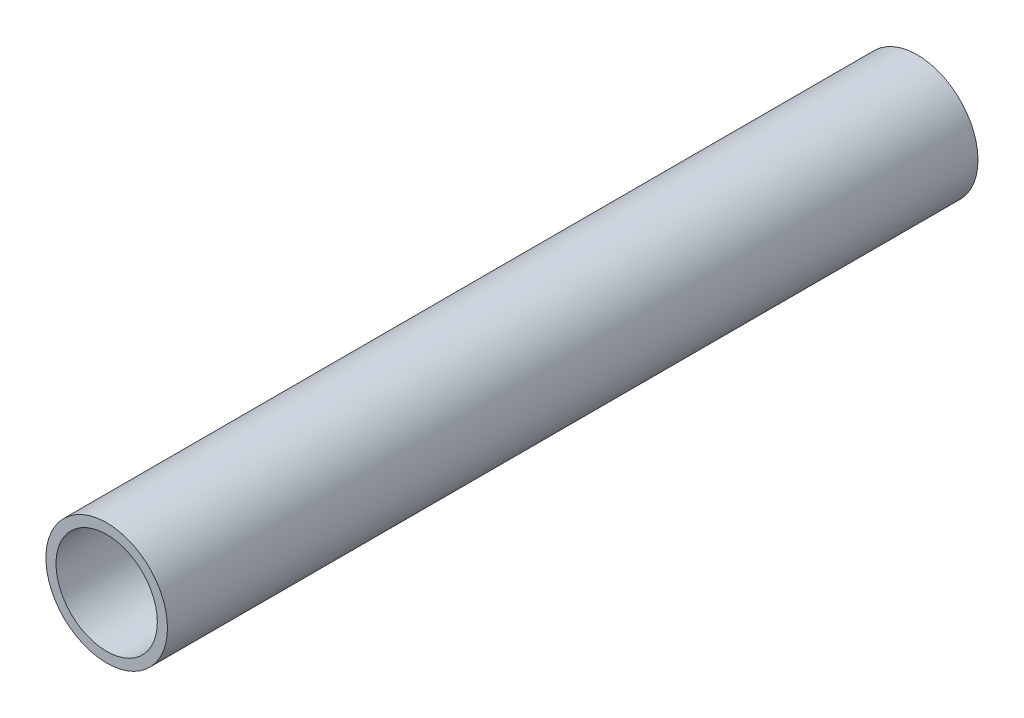
ISO-10303-21;
HEADER;
FILE_DESCRIPTION(('STEP AP214'),'2;1');
FILE_NAME('part.step','',(''),(''),'','','');
FILE_SCHEMA(('AUTOMOTIVE_DESIGN { 1 0 10303 214 1 1 1 1 }'));
ENDSEC;
DATA;
#1=APPLICATION_CONTEXT('core data for automotive mechanical design processes');
#2=APPLICATION_PROTOCOL_DEFINITION('international standard','automotive_design',2000,#1);
#3=PRODUCT_CONTEXT('',#1,'mechanical');
#4=PRODUCT('Part','Part','',(#3));
#5=PRODUCT_RELATED_PRODUCT_CATEGORY('part','',(#4));
#6=PRODUCT_DEFINITION_FORMATION('','',#4);
#7=PRODUCT_DEFINITION_CONTEXT('part definition',#1,'design');
#8=PRODUCT_DEFINITION('design','',#6,#7);
#9=PRODUCT_DEFINITION_SHAPE('','',#8);
#10=(LENGTH_UNIT() NAMED_UNIT(*) SI_UNIT(.MILLI.,.METRE.));
#11=(NAMED_UNIT(*) PLANE_ANGLE_UNIT() SI_UNIT($,.RADIAN.));
#12=(NAMED_UNIT(*) SI_UNIT($,.STERADIAN.) SOLID_ANGLE_UNIT());
#13=UNCERTAINTY_MEASURE_WITH_UNIT(LENGTH_MEASURE(1.E-05),#10,'distance_accuracy_value','');
#14=(GEOMETRIC_REPRESENTATION_CONTEXT(3) GLOBAL_UNCERTAINTY_ASSIGNED_CONTEXT((#13)) GLOBAL_UNIT_ASSIGNED_CONTEXT((#10,
#11,#12)) REPRESENTATION_CONTEXT('',''));
#15=CARTESIAN_POINT('',(0.,0.,0.));
#16=DIRECTION('',(0.,0.,1.));
#17=DIRECTION('',(1.,0.,0.));
#18=AXIS2_PLACEMENT_3D('',#15,#16,#17);
#19=CARTESIAN_POINT('',(0.,0.,80.));
#20=DIRECTION('',(0.,0.,1.));
#21=DIRECTION('',(1.,0.,0.));
#22=AXIS2_PLACEMENT_3D('',#19,#20,#21);
#23=PLANE('',#22);
#24=CARTESIAN_POINT('',(0.,0.,80.));
#25=DIRECTION('',(0.,0.,1.));
#26=DIRECTION('',(1.,0.,0.));
#27=AXIS2_PLACEMENT_3D('',#24,#25,#26);
#28=CIRCLE('',#27,6.);
#29=CARTESIAN_POINT('',(6.,0.,80.));
#30=VERTEX_POINT('',#29);
#31=EDGE_CURVE('E10',#30,#30,#28,.T.);
#32=ORIENTED_EDGE('',*,*,#31,.T.);
#33=EDGE_LOOP('',(#32));
#34=FACE_BOUND('',#33,.T.);
#35=CARTESIAN_POINT('',(0.,0.,80.));
#36=DIRECTION('',(0.,0.,1.));
#37=DIRECTION('',(1.,0.,0.));
#38=AXIS2_PLACEMENT_3D('',#35,#36,#37);
#39=CIRCLE('',#38,5.);
#40=CARTESIAN_POINT('',(5.,0.,80.));
#41=VERTEX_POINT('',#40);
#42=EDGE_CURVE('E50',#41,#41,#39,.T.);
#43=ORIENTED_EDGE('',*,*,#42,.F.);
#44=EDGE_LOOP('',(#43));
#45=FACE_BOUND('',#44,.T.);
#46=ADVANCED_FACE('F37',(#34,#45),#23,.T.);
#47=CARTESIAN_POINT('',(0.,0.,0.));
#48=DIRECTION('',(0.,0.,1.));
#49=DIRECTION('',(1.,0.,0.));
#50=AXIS2_PLACEMENT_3D('',#47,#48,#49);
#51=PLANE('',#50);
#52=CARTESIAN_POINT('',(0.,0.,0.));
#53=DIRECTION('',(0.,0.,1.));
#54=DIRECTION('',(1.,0.,0.));
#55=AXIS2_PLACEMENT_3D('',#52,#53,#54);
#56=CIRCLE('',#55,6.);
#57=CARTESIAN_POINT('',(6.,0.,0.));
#58=VERTEX_POINT('',#57);
#59=EDGE_CURVE('E41',#58,#58,#56,.T.);
#60=ORIENTED_EDGE('',*,*,#59,.F.);
#61=EDGE_LOOP('',(#60));
#62=FACE_BOUND('',#61,.T.);
#63=CARTESIAN_POINT('',(0.,0.,0.));
#64=DIRECTION('',(0.,0.,1.));
#65=DIRECTION('',(1.,0.,0.));
#66=AXIS2_PLACEMENT_3D('',#63,#64,#65);
#67=CIRCLE('',#66,5.);
#68=CARTESIAN_POINT('',(5.,0.,0.));
#69=VERTEX_POINT('',#68);
#70=EDGE_CURVE('E52',#69,#69,#67,.T.);
#71=ORIENTED_EDGE('',*,*,#70,.T.);
#72=EDGE_LOOP('',(#71));
#73=FACE_BOUND('',#72,.T.);
#74=ADVANCED_FACE('F64',(#62,#73),#51,.F.);
#75=CARTESIAN_POINT('',(0.,0.,80.));
#76=DIRECTION('',(0.,0.,-1.));
#77=DIRECTION('',(-1.,0.,0.));
#78=AXIS2_PLACEMENT_3D('',#75,#76,#77);
#79=CYLINDRICAL_SURFACE('',#78,6.);
#80=ORIENTED_EDGE('',*,*,#31,.F.);
#81=EDGE_LOOP('',(#80));
#82=FACE_BOUND('',#81,.T.);
#83=ORIENTED_EDGE('',*,*,#59,.T.);
#84=EDGE_LOOP('',(#83));
#85=FACE_BOUND('',#84,.T.);
#86=ADVANCED_FACE('F39',(#82,#85),#79,.T.);
#87=CARTESIAN_POINT('',(0.,0.,80.));
#88=DIRECTION('',(0.,0.,-1.));
#89=DIRECTION('',(-1.,0.,0.));
#90=AXIS2_PLACEMENT_3D('',#87,#88,#89);
#91=CYLINDRICAL_SURFACE('',#90,5.);
#92=ORIENTED_EDGE('',*,*,#42,.T.);
#93=EDGE_LOOP('',(#92));
#94=FACE_BOUND('',#93,.T.);
#95=ORIENTED_EDGE('',*,*,#70,.F.);
#96=EDGE_LOOP('',(#95));
#97=FACE_BOUND('',#96,.T.);
#98=ADVANCED_FACE('F60',(#94,#97),#91,.F.);
#99=CLOSED_SHELL('',(#46,#74,#86,#98));
#100=MANIFOLD_SOLID_BREP('B2',#99);
#101=ADVANCED_BREP_SHAPE_REPRESENTATION('',(#18,#100),#14);
#102=SHAPE_DEFINITION_REPRESENTATION(#9,#101);
ENDSEC;
END-ISO-10303-21;
